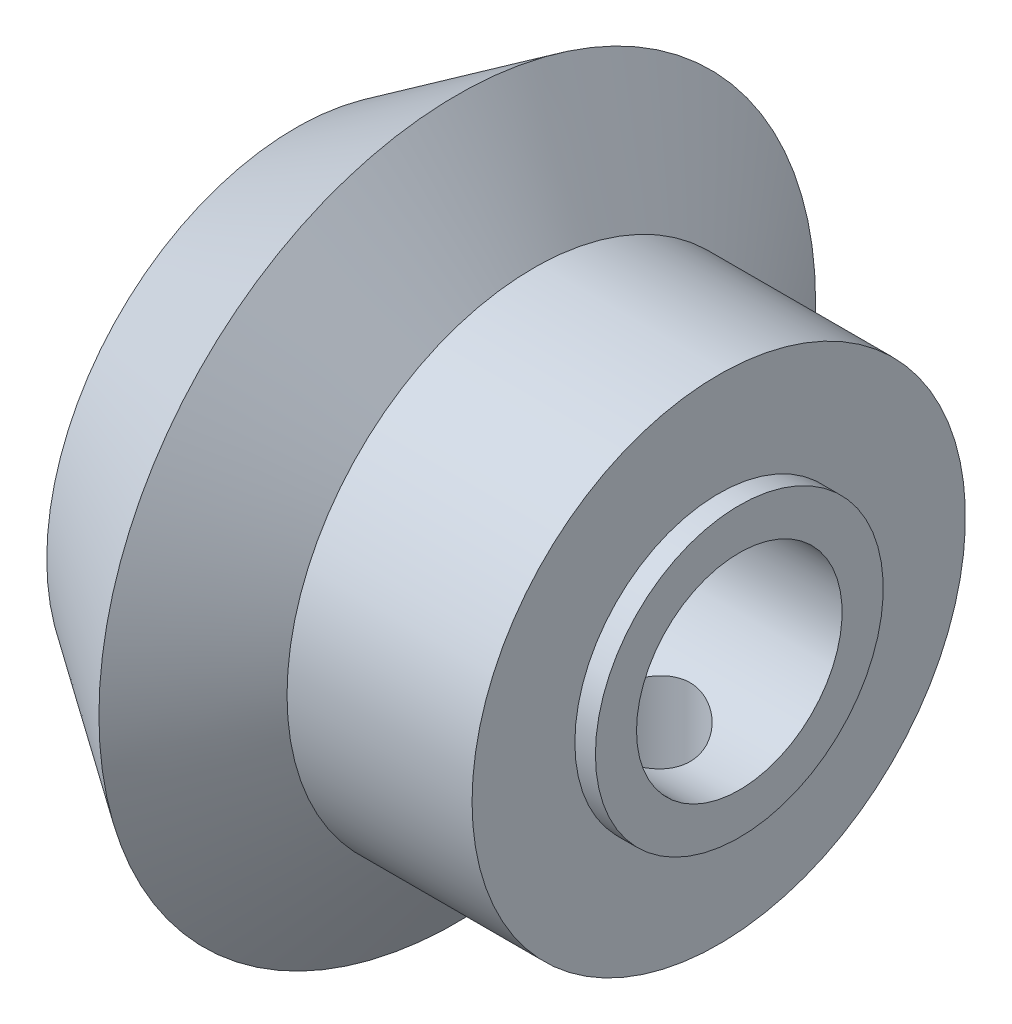
ISO-10303-21;
HEADER;
FILE_DESCRIPTION(('STEP AP214'),'2;1');
FILE_NAME('part.step','',(''),(''),'','','');
FILE_SCHEMA(('AUTOMOTIVE_DESIGN { 1 0 10303 214 1 1 1 1 }'));
ENDSEC;
DATA;
#1=APPLICATION_CONTEXT('core data for automotive mechanical design processes');
#2=APPLICATION_PROTOCOL_DEFINITION('international standard','automotive_design',2000,#1);
#3=PRODUCT_CONTEXT('',#1,'mechanical');
#4=PRODUCT('Part','Part','',(#3));
#5=PRODUCT_RELATED_PRODUCT_CATEGORY('part','',(#4));
#6=PRODUCT_DEFINITION_FORMATION('','',#4);
#7=PRODUCT_DEFINITION_CONTEXT('part definition',#1,'design');
#8=PRODUCT_DEFINITION('design','',#6,#7);
#9=PRODUCT_DEFINITION_SHAPE('','',#8);
#10=(LENGTH_UNIT() NAMED_UNIT(*) SI_UNIT(.MILLI.,.METRE.));
#11=(NAMED_UNIT(*) PLANE_ANGLE_UNIT() SI_UNIT($,.RADIAN.));
#12=(NAMED_UNIT(*) SI_UNIT($,.STERADIAN.) SOLID_ANGLE_UNIT());
#13=UNCERTAINTY_MEASURE_WITH_UNIT(LENGTH_MEASURE(1.E-05),#10,'distance_accuracy_value','');
#14=(GEOMETRIC_REPRESENTATION_CONTEXT(3) GLOBAL_UNCERTAINTY_ASSIGNED_CONTEXT((#13)) GLOBAL_UNIT_ASSIGNED_CONTEXT((#10,
#11,#12)) REPRESENTATION_CONTEXT('',''));
#15=CARTESIAN_POINT('',(0.,0.,0.));
#16=DIRECTION('',(0.,0.,1.));
#17=DIRECTION('',(1.,0.,0.));
#18=AXIS2_PLACEMENT_3D('',#15,#16,#17);
#19=CARTESIAN_POINT('',(22.5,0.,0.));
#20=DIRECTION('',(-1.,0.,0.));
#21=DIRECTION('',(0.,0.,1.));
#22=AXIS2_PLACEMENT_3D('',#19,#20,#21);
#23=CYLINDRICAL_SURFACE('',#22,2.5);
#24=CARTESIAN_POINT('',(20.,-2.13541565040627,-1.29999999999999));
#25=CARTESIAN_POINT('',(19.9326910007546,-2.13542218510378,-1.2999949920218));
#26=CARTESIAN_POINT('',(19.8653068560897,-2.13864723650628,-1.29473701672371));
#27=CARTESIAN_POINT('',(19.7326418043946,-2.15106664383973,-1.27398927979969));
#28=CARTESIAN_POINT('',(19.6673652159484,-2.1602725295249,-1.25847975439629));
#29=CARTESIAN_POINT('',(19.5410895404373,-2.18329096498212,-1.21810181079737));
#30=CARTESIAN_POINT('',(19.4800685095934,-2.19707737979652,-1.19328638783913));
#31=CARTESIAN_POINT('',(19.3630732351483,-2.22766227770052,-1.13516352123658));
#32=CARTESIAN_POINT('',(19.3070996023529,-2.24446112460343,-1.10185505167651));
#33=CARTESIAN_POINT('',(19.196256350152,-2.2810137465525,-1.02419532044111));
#34=CARTESIAN_POINT('',(19.1419353086481,-2.30089741785951,-0.979121896827729));
#35=CARTESIAN_POINT('',(19.0411917285219,-2.34033381565221,-0.880709450271065));
#36=CARTESIAN_POINT('',(18.9947734161944,-2.35988636005306,-0.827366033575865));
#37=CARTESIAN_POINT('',(18.9077653520411,-2.39819471975978,-0.709085538887546));
#38=CARTESIAN_POINT('',(18.8678659729338,-2.41678309039593,-0.643581229035656));
#39=CARTESIAN_POINT('',(18.7999060385296,-2.44935371352648,-0.505641388544536));
#40=CARTESIAN_POINT('',(18.7718374123784,-2.46333910470838,-0.433210624601337));
#41=CARTESIAN_POINT('',(18.7305607660213,-2.48418681583152,-0.289298945506802));
#42=CARTESIAN_POINT('',(18.7163862459182,-2.49150934080119,-0.218163460154726));
#43=CARTESIAN_POINT('',(18.7001013003356,-2.49993700304784,-0.0741778008891644));
#44=CARTESIAN_POINT('',(18.6979828790147,-2.50104626107773,-0.00132879562041532));
#45=CARTESIAN_POINT('',(18.7055340615493,-2.49712573383651,0.136682456405426));
#46=CARTESIAN_POINT('',(18.7141157349075,-2.49266247499283,0.20192431553851));
#47=CARTESIAN_POINT('',(18.7408542466155,-2.47897486045309,0.32988599388821));
#48=CARTESIAN_POINT('',(18.7590118073897,-2.46975014554423,0.392605622438355));
#49=CARTESIAN_POINT('',(18.8044626951781,-2.44722620871872,0.514777576681895));
#50=CARTESIAN_POINT('',(18.8318702044712,-2.43387624736632,0.574177681565647));
#51=CARTESIAN_POINT('',(18.8948632843745,-2.40427842476177,0.687669921056001));
#52=CARTESIAN_POINT('',(18.9304516852382,-2.3880295610447,0.741760209420256));
#53=CARTESIAN_POINT('',(19.0128716336526,-2.35221370900834,0.848875674255685));
#54=CARTESIAN_POINT('',(19.0604716841809,-2.33247739567263,0.901253228298807));
#55=CARTESIAN_POINT('',(19.1635269074575,-2.29290702169619,0.99764619149215));
#56=CARTESIAN_POINT('',(19.2189889018827,-2.27307289076016,1.04165426010071));
#57=CARTESIAN_POINT('',(19.3410992009193,-2.23395831464774,1.12321984532313));
#58=CARTESIAN_POINT('',(19.4082677068647,-2.21482304995731,1.16007544362623));
#59=CARTESIAN_POINT('',(19.5490549319147,-2.18144537006634,1.22169363677282));
#60=CARTESIAN_POINT('',(19.6226664239019,-2.16719755868201,1.2464695814513));
#61=CARTESIAN_POINT('',(19.768041790662,-2.14687223354658,1.28113869349277));
#62=CARTESIAN_POINT('',(19.8394748643933,-2.14022786744823,1.29207210047855));
#63=CARTESIAN_POINT('',(19.9834441525023,-2.13427299745983,1.30189057145277));
#64=CARTESIAN_POINT('',(20.0559793738337,-2.13495624207002,1.30078590562576));
#65=CARTESIAN_POINT('',(20.1905525909655,-2.14297632381999,1.28751419422176));
#66=CARTESIAN_POINT('',(20.2527845989002,-2.14948465404406,1.27672416536976));
#67=CARTESIAN_POINT('',(20.3744154013213,-2.16715522437387,1.24649206812443));
#68=CARTESIAN_POINT('',(20.4338131637549,-2.17831914555466,1.22704687428943));
#69=CARTESIAN_POINT('',(20.551183419197,-2.20462633850681,1.17915135897731));
#70=CARTESIAN_POINT('',(20.6089685989489,-2.2199273394449,1.15033209571266));
#71=CARTESIAN_POINT('',(20.7192241001006,-2.25266652106442,1.08481983617792));
#72=CARTESIAN_POINT('',(20.7716916683347,-2.27010579860659,1.04812279157547));
#73=CARTESIAN_POINT('',(20.8774324310823,-2.30805636532851,0.961968585041577));
#74=CARTESIAN_POINT('',(20.9298106825179,-2.32865859376251,0.9114480643208));
#75=CARTESIAN_POINT('',(21.0256575346832,-2.36855930108251,0.80206996953899));
#76=CARTESIAN_POINT('',(21.0691223106919,-2.38785721792472,0.74320883481062));
#77=CARTESIAN_POINT('',(21.1472577919734,-2.42383055698205,0.616079757666157));
#78=CARTESIAN_POINT('',(21.1815668700677,-2.44039035375406,0.547554418399358));
#79=CARTESIAN_POINT('',(21.2378151846433,-2.46811344440668,0.404596041904177));
#80=CARTESIAN_POINT('',(21.259766121915,-2.47928184147595,0.330168669217795));
#81=CARTESIAN_POINT('',(21.2886464619741,-2.49408770335634,0.185242302436255));
#82=CARTESIAN_POINT('',(21.2968176973625,-2.49834623904765,0.115054090191295));
#83=CARTESIAN_POINT('',(21.3016503525928,-2.50085731835905,-0.0258139751293538));
#84=CARTESIAN_POINT('',(21.2983165192592,-2.49911233894338,-0.0964936134403599));
#85=CARTESIAN_POINT('',(21.2810131453441,-2.4901702321934,-0.23074502543037));
#86=CARTESIAN_POINT('',(21.2678581948142,-2.48339088692572,-0.294452891678615));
#87=CARTESIAN_POINT('',(21.2324436062964,-2.46549879631304,-0.418632589796489));
#88=CARTESIAN_POINT('',(21.2101827577616,-2.45438547481431,-0.479103990198098));
#89=CARTESIAN_POINT('',(21.1562926942939,-2.42825778950366,-0.597836427433066));
#90=CARTESIAN_POINT('',(21.1243240115459,-2.41310502617537,-0.655911969712633));
#91=CARTESIAN_POINT('',(21.0523442918901,-2.38042028457294,-0.766098965877374));
#92=CARTESIAN_POINT('',(21.0123296628999,-2.36288724477302,-0.818207739555164));
#93=CARTESIAN_POINT('',(20.9204878123107,-2.3249443700486,-0.920833636857411));
#94=CARTESIAN_POINT('',(20.8678573195916,-2.30442678436291,-0.970593729651146));
#95=CARTESIAN_POINT('',(20.754810450567,-2.26427660920941,-1.06089570237737));
#96=CARTESIAN_POINT('',(20.6943862796372,-2.24464493265648,-1.10142823987706));
#97=CARTESIAN_POINT('',(20.564019263506,-2.20772266788278,-1.1737478150068));
#98=CARTESIAN_POINT('',(20.4937722879421,-2.19057533563931,-1.20506480327902));
#99=CARTESIAN_POINT('',(20.3478534410444,-2.16239301738629,-1.25494868861381));
#100=CARTESIAN_POINT('',(20.2722004684451,-2.15133781156507,-1.27355781297327));
#101=CARTESIAN_POINT('',(20.1630190071715,-2.14138529642278,-1.2901527655073));
#102=CARTESIAN_POINT('',(20.1305724586167,-2.1391563394257,-1.29383860106907));
#103=CARTESIAN_POINT('',(20.0654232028883,-2.13616988397473,-1.29876350890651));
#104=CARTESIAN_POINT('',(20.0327204804756,-2.1354124737368,-1.30000243449544));
#105=CARTESIAN_POINT('',(20.,-2.13541565040627,-1.29999999999999));
#106=B_SPLINE_CURVE_WITH_KNOTS('',3,(#24,#25,#26,#27,#28,#29,#30,#31,#32,#33,#34,#35,#36,#37,
#38,#39,#40,#41,#42,#43,#44,#45,#46,#47,#48,#49,#50,#51,#52,#53,#54,#55,#56,#57,#58,#59,#60,#61,
#62,#63,#64,#65,#66,#67,#68,#69,#70,#71,#72,#73,#74,#75,#76,#77,#78,#79,#80,#81,#82,#83,#84,#85,
#86,#87,#88,#89,#90,#91,#92,#93,#94,#95,#96,#97,#98,#99,#100,#101,#102,#103,#104,#105),
.UNSPECIFIED.,.T.,.F.,(4,2,2,2,2,2,2,2,2,2,2,2,2,2,2,2,2,2,2,2,2,2,2,2,2,2,2,2,2,2,2,2,2,2,2,2,
2,2,2,2,4),(0.,0.201788971065213,0.403968106542995,0.605012937933447,0.806082066006084,
1.02517227871208,1.24437929295831,1.47989162110131,1.71524302336942,1.93272508282477,
2.15006288708459,2.34699813827084,2.54394824877845,2.74342430450678,2.94296947491959,
3.16247266084571,3.38216748527563,3.61784041097209,3.85325228889402,4.06965447485713,
4.2858720535076,4.47550189926009,4.6652002773235,4.8635159052913,5.06193369117707,
5.28783344329276,5.51382992579937,5.74774755473537,5.981443334438,6.1926596444211,
6.40378882003651,6.59911820999191,6.79447357566487,6.9976521819436,7.2009216987552,
7.42578312501548,7.65087120953727,7.88598682814919,8.12031732272593,8.21840578615211,
8.31650012958248),.UNSPECIFIED.);
#107=CARTESIAN_POINT('',(20.,-2.13541565040627,-1.29999999999999));
#108=VERTEX_POINT('',#107);
#109=EDGE_CURVE('E93',#108,#108,#106,.T.);
#110=ORIENTED_EDGE('',*,*,#109,.F.);
#111=EDGE_LOOP('',(#110));
#112=FACE_BOUND('',#111,.T.);
#113=CARTESIAN_POINT('',(12.5,0.,0.));
#114=DIRECTION('',(-1.,0.,0.));
#115=DIRECTION('',(0.,0.,1.));
#116=AXIS2_PLACEMENT_3D('',#113,#114,#115);
#117=CIRCLE('',#116,2.5);
#118=CARTESIAN_POINT('',(12.5,0.,2.5));
#119=VERTEX_POINT('',#118);
#120=EDGE_CURVE('E10',#119,#119,#117,.T.);
#121=ORIENTED_EDGE('',*,*,#120,.T.);
#122=EDGE_LOOP('',(#121));
#123=FACE_BOUND('',#122,.T.);
#124=CARTESIAN_POINT('',(22.5,0.,0.));
#125=DIRECTION('',(-1.,0.,0.));
#126=DIRECTION('',(0.,0.,1.));
#127=AXIS2_PLACEMENT_3D('',#124,#125,#126);
#128=CIRCLE('',#127,2.5);
#129=CARTESIAN_POINT('',(22.5,0.,2.5));
#130=VERTEX_POINT('',#129);
#131=EDGE_CURVE('E80',#130,#130,#128,.T.);
#132=ORIENTED_EDGE('',*,*,#131,.F.);
#133=EDGE_LOOP('',(#132));
#134=FACE_BOUND('',#133,.T.);
#135=ADVANCED_FACE('F41',(#112,#123,#134),#23,.F.);
#136=CARTESIAN_POINT('',(12.5,2.5,0.));
#137=DIRECTION('',(-1.,0.,0.));
#138=DIRECTION('',(0.,0.,1.));
#139=AXIS2_PLACEMENT_3D('',#136,#137,#138);
#140=PLANE('',#139);
#141=CARTESIAN_POINT('',(12.5,0.,0.));
#142=DIRECTION('',(-1.,0.,0.));
#143=DIRECTION('',(0.,0.,1.));
#144=AXIS2_PLACEMENT_3D('',#141,#142,#143);
#145=CIRCLE('',#144,4.9);
#146=CARTESIAN_POINT('',(12.5,0.,4.9));
#147=VERTEX_POINT('',#146);
#148=EDGE_CURVE('E48',#147,#147,#145,.T.);
#149=ORIENTED_EDGE('',*,*,#148,.T.);
#150=EDGE_LOOP('',(#149));
#151=FACE_BOUND('',#150,.T.);
#152=ORIENTED_EDGE('',*,*,#120,.F.);
#153=EDGE_LOOP('',(#152));
#154=FACE_BOUND('',#153,.T.);
#155=ADVANCED_FACE('F126',(#151,#154),#140,.T.);
#156=CARTESIAN_POINT('',(12.5,0.,0.));
#157=DIRECTION('',(-1.,0.,0.));
#158=DIRECTION('',(0.,0.,1.));
#159=AXIS2_PLACEMENT_3D('',#156,#157,#158);
#160=CONICAL_SURFACE('',#159,4.9,0.970152171669279);
#161=CARTESIAN_POINT('',(11.71,0.,0.));
#162=DIRECTION('',(-1.,0.,0.));
#163=DIRECTION('',(0.,0.,1.));
#164=AXIS2_PLACEMENT_3D('',#161,#162,#163);
#165=CIRCLE('',#164,6.05314516129031);
#166=CARTESIAN_POINT('',(11.71,0.,6.05314516129031));
#167=VERTEX_POINT('',#166);
#168=EDGE_CURVE('E53',#167,#167,#165,.T.);
#169=ORIENTED_EDGE('',*,*,#168,.T.);
#170=EDGE_LOOP('',(#169));
#171=FACE_BOUND('',#170,.T.);
#172=ORIENTED_EDGE('',*,*,#148,.F.);
#173=EDGE_LOOP('',(#172));
#174=FACE_BOUND('',#173,.T.);
#175=ADVANCED_FACE('F131',(#171,#174),#160,.F.);
#176=CARTESIAN_POINT('',(11.71,0.,0.));
#177=DIRECTION('',(1.,0.,0.));
#178=DIRECTION('',(0.,0.,-1.));
#179=AXIS2_PLACEMENT_3D('',#176,#177,#178);
#180=CONICAL_SURFACE('',#179,6.05314516129031,0.595339543662418);
#181=CARTESIAN_POINT('',(15.64,0.,0.));
#182=DIRECTION('',(-1.,0.,0.));
#183=DIRECTION('',(0.,0.,1.));
#184=AXIS2_PLACEMENT_3D('',#181,#182,#183);
#185=CIRCLE('',#184,8.715);
#186=CARTESIAN_POINT('',(15.64,0.,8.715));
#187=VERTEX_POINT('',#186);
#188=EDGE_CURVE('E58',#187,#187,#185,.T.);
#189=ORIENTED_EDGE('',*,*,#188,.T.);
#190=EDGE_LOOP('',(#189));
#191=FACE_BOUND('',#190,.T.);
#192=ORIENTED_EDGE('',*,*,#168,.F.);
#193=EDGE_LOOP('',(#192));
#194=FACE_BOUND('',#193,.T.);
#195=ADVANCED_FACE('F145',(#191,#194),#180,.T.);
#196=CARTESIAN_POINT('',(15.64,0.,0.));
#197=DIRECTION('',(-1.,0.,0.));
#198=DIRECTION('',(0.,0.,1.));
#199=AXIS2_PLACEMENT_3D('',#196,#197,#198);
#200=CONICAL_SURFACE('',#199,8.715,0.97015217166928);
#201=CARTESIAN_POINT('',(17.5,0.,0.));
#202=DIRECTION('',(-1.,0.,0.));
#203=DIRECTION('',(0.,0.,1.));
#204=AXIS2_PLACEMENT_3D('',#201,#202,#203);
#205=CIRCLE('',#204,6.);
#206=CARTESIAN_POINT('',(17.5,0.,6.));
#207=VERTEX_POINT('',#206);
#208=EDGE_CURVE('E64',#207,#207,#205,.T.);
#209=ORIENTED_EDGE('',*,*,#208,.T.);
#210=EDGE_LOOP('',(#209));
#211=FACE_BOUND('',#210,.T.);
#212=ORIENTED_EDGE('',*,*,#188,.F.);
#213=EDGE_LOOP('',(#212));
#214=FACE_BOUND('',#213,.T.);
#215=ADVANCED_FACE('F122',(#211,#214),#200,.T.);
#216=CARTESIAN_POINT('',(22.5,0.,0.));
#217=DIRECTION('',(-1.,0.,0.));
#218=DIRECTION('',(0.,0.,1.));
#219=AXIS2_PLACEMENT_3D('',#216,#217,#218);
#220=CYLINDRICAL_SURFACE('',#219,6.);
#221=CARTESIAN_POINT('',(20.,-5.85747385824299,-1.29999999999999));
#222=CARTESIAN_POINT('',(20.0720959644854,-5.85747531500166,-1.29999749767371));
#223=CARTESIAN_POINT('',(20.1442221657917,-5.85881942885965,-1.29398211142506));
#224=CARTESIAN_POINT('',(20.2864246569857,-5.86404100145795,-1.27010511860806));
#225=CARTESIAN_POINT('',(20.3564994076278,-5.86792031396106,-1.252234843481));
#226=CARTESIAN_POINT('',(20.4925213786534,-5.87775277434159,-1.20523615570782));
#227=CARTESIAN_POINT('',(20.5584729894188,-5.88370367041878,-1.17611996356439));
#228=CARTESIAN_POINT('',(20.6845564217766,-5.89700607552491,-1.10749074818798));
#229=CARTESIAN_POINT('',(20.7446883863978,-5.90435755011882,-1.06797798055928));
#230=CARTESIAN_POINT('',(20.8584236643351,-5.91976894625052,-0.978978999862543));
#231=CARTESIAN_POINT('',(20.9119164513279,-5.9278377856357,-0.92935306092137));
#232=CARTESIAN_POINT('',(21.0098872664673,-5.9436966362831,-0.821838096647292));
#233=CARTESIAN_POINT('',(21.0543646020052,-5.951486626085,-0.763948437038994));
#234=CARTESIAN_POINT('',(21.1334782206719,-5.96600706833303,-0.640809308139366));
#235=CARTESIAN_POINT('',(21.1680083430048,-5.97272577210431,-0.575490128831361));
#236=CARTESIAN_POINT('',(21.2255607302339,-5.98424595616476,-0.439806424883607));
#237=CARTESIAN_POINT('',(21.2485842618448,-5.98904764747848,-0.3694424565802));
#238=CARTESIAN_POINT('',(21.2821226969197,-5.99612976904131,-0.226815524635825));
#239=CARTESIAN_POINT('',(21.2928246134726,-5.99844785585483,-0.154598438082867));
#240=CARTESIAN_POINT('',(21.3020006013742,-6.00043200419659,-0.009359192623335));
#241=CARTESIAN_POINT('',(21.300476046447,-6.00009836366381,0.0636628749177145));
#242=CARTESIAN_POINT('',(21.2853819433744,-5.99684547424273,0.207150513190079));
#243=CARTESIAN_POINT('',(21.2720139564374,-5.99396949476516,0.277638412144284));
#244=CARTESIAN_POINT('',(21.2339334812359,-5.98600431827747,0.415346031902478));
#245=CARTESIAN_POINT('',(21.2092204863949,-5.98091502243904,0.48256560662123));
#246=CARTESIAN_POINT('',(21.1489722590829,-5.96902527175297,0.612389756688207));
#247=CARTESIAN_POINT('',(21.1133603322126,-5.96221275171851,0.674957589819143));
#248=CARTESIAN_POINT('',(21.0323822720997,-5.94762399469264,0.793302835456985));
#249=CARTESIAN_POINT('',(20.9870148333526,-5.93984762877625,0.849079337566456));
#250=CARTESIAN_POINT('',(20.8867152501562,-5.92399928738182,0.953457121683411));
#251=CARTESIAN_POINT('',(20.8316066963435,-5.91592451816102,1.0018886095494));
#252=CARTESIAN_POINT('',(20.7139665682368,-5.90053843481079,1.08885367103302));
#253=CARTESIAN_POINT('',(20.6514348003458,-5.89322714060209,1.1273869864241));
#254=CARTESIAN_POINT('',(20.5204522792632,-5.88018864798579,1.19353539711733));
#255=CARTESIAN_POINT('',(20.4519850986997,-5.87446604298271,1.22111892997449));
#256=CARTESIAN_POINT('',(20.3112340863,-5.86531689947503,1.26433806547944));
#257=CARTESIAN_POINT('',(20.2389508492348,-5.86189000429386,1.27997552420088));
#258=CARTESIAN_POINT('',(20.0941696276351,-5.8577928878519,1.29859634917858));
#259=CARTESIAN_POINT('',(20.0217048963842,-5.85706886589901,1.30182671665826));
#260=CARTESIAN_POINT('',(19.8772722945399,-5.85831442390234,1.29620992514146));
#261=CARTESIAN_POINT('',(19.8053043908311,-5.86028382255537,1.28736357906921));
#262=CARTESIAN_POINT('',(19.6647649917051,-5.86664356339701,1.25805862725509));
#263=CARTESIAN_POINT('',(19.5961638277044,-5.87100562292013,1.23773560132801));
#264=CARTESIAN_POINT('',(19.4633403277701,-5.88163375889469,1.18620077709964));
#265=CARTESIAN_POINT('',(19.3991184051537,-5.88790001476244,1.15498795270366));
#266=CARTESIAN_POINT('',(19.2758061518795,-5.90174900137633,1.08201366377292));
#267=CARTESIAN_POINT('',(19.2168081450638,-5.90935021296849,1.0400997687433));
#268=CARTESIAN_POINT('',(19.1065924921739,-5.9249636844826,0.947112997186249));
#269=CARTESIAN_POINT('',(19.0553757946983,-5.93297599436142,0.896039005628123));
#270=CARTESIAN_POINT('',(18.9612204196453,-5.94868591324939,0.785065130958196));
#271=CARTESIAN_POINT('',(18.918449983417,-5.9563751038379,0.725021111301402));
#272=CARTESIAN_POINT('',(18.8436032294803,-5.97041850650749,0.598456949787448));
#273=CARTESIAN_POINT('',(18.8115264174504,-5.97677278029119,0.531937107464227));
#274=CARTESIAN_POINT('',(18.7592130058622,-5.98739484509151,0.394719938021809));
#275=CARTESIAN_POINT('',(18.7389022178849,-5.9916756810689,0.324051950474322));
#276=CARTESIAN_POINT('',(18.7104653073464,-5.9977248887135,0.180203916267262));
#277=CARTESIAN_POINT('',(18.7023374484539,-5.99949361840842,0.10702422910031));
#278=CARTESIAN_POINT('',(18.698573956844,-6.00030894171237,-0.0381716522929328));
#279=CARTESIAN_POINT('',(18.7026869382168,-5.99941031491213,-0.110181138254949));
#280=CARTESIAN_POINT('',(18.7227269028294,-5.99510901226538,-0.252456573698035));
#281=CARTESIAN_POINT('',(18.7386536814043,-5.99170637979887,-0.322722553362224));
#282=CARTESIAN_POINT('',(18.78174963209,-5.98278315847891,-0.459326240145635));
#283=CARTESIAN_POINT('',(18.8088837661921,-5.9772691743141,-0.525675459979667));
#284=CARTESIAN_POINT('',(18.8735897857069,-5.96471260593241,-0.652913171648609));
#285=CARTESIAN_POINT('',(18.911162663685,-5.95766987636908,-0.713801143473421));
#286=CARTESIAN_POINT('',(18.996502544631,-5.94266055785238,-0.829616132209556));
#287=CARTESIAN_POINT('',(19.0444466848533,-5.9346791821112,-0.88441071903242));
#288=CARTESIAN_POINT('',(19.1488100545042,-5.91877268697354,-0.985262725830098));
#289=CARTESIAN_POINT('',(19.2052313191902,-5.91084758156673,-1.03131804158381));
#290=CARTESIAN_POINT('',(19.3258336358658,-5.8958356818225,-1.11396299982405));
#291=CARTESIAN_POINT('',(19.3901064384832,-5.8887611927541,-1.15042111226836));
#292=CARTESIAN_POINT('',(19.524005753412,-5.87640571391333,-1.21196066914674));
#293=CARTESIAN_POINT('',(19.5936276375314,-5.87112319463655,-1.23705182181852));
#294=CARTESIAN_POINT('',(19.7194423048309,-5.86393537669706,-1.27062125306132));
#295=CARTESIAN_POINT('',(19.7749483711363,-5.86152826566864,-1.28161731968111));
#296=CARTESIAN_POINT('',(19.8869634603934,-5.85829697249102,-1.29630750280118));
#297=CARTESIAN_POINT('',(19.943472436152,-5.85747271605675,-1.300001961974));
#298=CARTESIAN_POINT('',(20.,-5.85747385824299,-1.29999999999999));
#299=B_SPLINE_CURVE_WITH_KNOTS('',3,(#221,#222,#223,#224,#225,#226,#227,#228,#229,#230,#231,
#232,#233,#234,#235,#236,#237,#238,#239,#240,#241,#242,#243,#244,#245,#246,#247,#248,#249,#250,
#251,#252,#253,#254,#255,#256,#257,#258,#259,#260,#261,#262,#263,#264,#265,#266,#267,#268,#269,
#270,#271,#272,#273,#274,#275,#276,#277,#278,#279,#280,#281,#282,#283,#284,#285,#286,#287,#288,
#289,#290,#291,#292,#293,#294,#295,#296,#297,#298),.UNSPECIFIED.,.T.,.F.,(4,2,2,2,2,2,2,2,2,2,2,
2,2,2,2,2,2,2,2,2,2,2,2,2,2,2,2,2,2,2,2,2,2,2,2,2,2,2,4),(0.,0.21608074691167,0.432319671294132,
0.648324275315669,0.864323569267357,1.08353864408197,1.3027705536335,1.52426216905732,
1.74572939597703,1.96378902165776,2.18182414725519,2.39621836315409,2.61062215310067,
2.82657078542649,3.04254833448987,3.26293657147358,3.48333055742921,3.70435528863423,
3.92534567201453,4.14191304435373,4.35846583953309,4.57251235368622,4.78657904188925,
5.00388399545812,5.22121541887366,5.44251547780296,5.66380530553607,5.8836842037483,
6.10353176147237,6.31889574901571,6.53425600562985,6.74894800869525,6.96366043268874,
7.1823793317299,7.40115082675488,7.62278056407419,7.84422065442667,8.01364888228925,
8.18306915850803),.UNSPECIFIED.);
#300=CARTESIAN_POINT('',(20.,-5.85747385824299,-1.29999999999999));
#301=VERTEX_POINT('',#300);
#302=EDGE_CURVE('E84',#301,#301,#299,.T.);
#303=ORIENTED_EDGE('',*,*,#302,.F.);
#304=EDGE_LOOP('',(#303));
#305=FACE_BOUND('',#304,.T.);
#306=CARTESIAN_POINT('',(22.,0.,0.));
#307=DIRECTION('',(-1.,0.,0.));
#308=DIRECTION('',(0.,0.,1.));
#309=AXIS2_PLACEMENT_3D('',#306,#307,#308);
#310=CIRCLE('',#309,6.);
#311=CARTESIAN_POINT('',(22.,0.,6.));
#312=VERTEX_POINT('',#311);
#313=EDGE_CURVE('E68',#312,#312,#310,.T.);
#314=ORIENTED_EDGE('',*,*,#313,.T.);
#315=EDGE_LOOP('',(#314));
#316=FACE_BOUND('',#315,.T.);
#317=ORIENTED_EDGE('',*,*,#208,.F.);
#318=EDGE_LOOP('',(#317));
#319=FACE_BOUND('',#318,.T.);
#320=ADVANCED_FACE('F98',(#305,#316,#319),#220,.T.);
#321=CARTESIAN_POINT('',(22.,6.,0.));
#322=DIRECTION('',(1.,0.,0.));
#323=DIRECTION('',(0.,0.,-1.));
#324=AXIS2_PLACEMENT_3D('',#321,#322,#323);
#325=PLANE('',#324);
#326=CARTESIAN_POINT('',(22.,0.,0.));
#327=DIRECTION('',(-1.,0.,0.));
#328=DIRECTION('',(0.,0.,1.));
#329=AXIS2_PLACEMENT_3D('',#326,#327,#328);
#330=CIRCLE('',#329,3.5);
#331=CARTESIAN_POINT('',(22.,0.,3.5));
#332=VERTEX_POINT('',#331);
#333=EDGE_CURVE('E72',#332,#332,#330,.T.);
#334=ORIENTED_EDGE('',*,*,#333,.T.);
#335=EDGE_LOOP('',(#334));
#336=FACE_BOUND('',#335,.T.);
#337=ORIENTED_EDGE('',*,*,#313,.F.);
#338=EDGE_LOOP('',(#337));
#339=FACE_BOUND('',#338,.T.);
#340=ADVANCED_FACE('F115',(#336,#339),#325,.T.);
#341=CARTESIAN_POINT('',(22.5,0.,0.));
#342=DIRECTION('',(-1.,0.,0.));
#343=DIRECTION('',(0.,0.,1.));
#344=AXIS2_PLACEMENT_3D('',#341,#342,#343);
#345=CYLINDRICAL_SURFACE('',#344,3.5);
#346=CARTESIAN_POINT('',(22.5,0.,0.));
#347=DIRECTION('',(-1.,0.,0.));
#348=DIRECTION('',(0.,0.,1.));
#349=AXIS2_PLACEMENT_3D('',#346,#347,#348);
#350=CIRCLE('',#349,3.5);
#351=CARTESIAN_POINT('',(22.5,0.,3.5));
#352=VERTEX_POINT('',#351);
#353=EDGE_CURVE('E76',#352,#352,#350,.T.);
#354=ORIENTED_EDGE('',*,*,#353,.T.);
#355=EDGE_LOOP('',(#354));
#356=FACE_BOUND('',#355,.T.);
#357=ORIENTED_EDGE('',*,*,#333,.F.);
#358=EDGE_LOOP('',(#357));
#359=FACE_BOUND('',#358,.T.);
#360=ADVANCED_FACE('F112',(#356,#359),#345,.T.);
#361=CARTESIAN_POINT('',(22.5,3.5,0.));
#362=DIRECTION('',(1.,0.,0.));
#363=DIRECTION('',(0.,0.,-1.));
#364=AXIS2_PLACEMENT_3D('',#361,#362,#363);
#365=PLANE('',#364);
#366=ORIENTED_EDGE('',*,*,#131,.T.);
#367=EDGE_LOOP('',(#366));
#368=FACE_BOUND('',#367,.T.);
#369=ORIENTED_EDGE('',*,*,#353,.F.);
#370=EDGE_LOOP('',(#369));
#371=FACE_BOUND('',#370,.T.);
#372=ADVANCED_FACE('F105',(#368,#371),#365,.T.);
#373=CARTESIAN_POINT('',(20.,-6.,0.));
#374=DIRECTION('',(0.,-1.,0.));
#375=DIRECTION('',(0.,0.,-1.));
#376=AXIS2_PLACEMENT_3D('',#373,#374,#375);
#377=CYLINDRICAL_SURFACE('',#376,1.29999999999999);
#378=ORIENTED_EDGE('',*,*,#302,.T.);
#379=EDGE_LOOP('',(#378));
#380=FACE_BOUND('',#379,.T.);
#381=ORIENTED_EDGE('',*,*,#109,.T.);
#382=EDGE_LOOP('',(#381));
#383=FACE_BOUND('',#382,.T.);
#384=ADVANCED_FACE('F102',(#380,#383),#377,.F.);
#385=CLOSED_SHELL('',(#135,#155,#175,#195,#215,#320,#340,#360,#372,#384));
#386=MANIFOLD_SOLID_BREP('B2',#385);
#387=ADVANCED_BREP_SHAPE_REPRESENTATION('',(#18,#386),#14);
#388=SHAPE_DEFINITION_REPRESENTATION(#9,#387);
ENDSEC;
END-ISO-10303-21;
